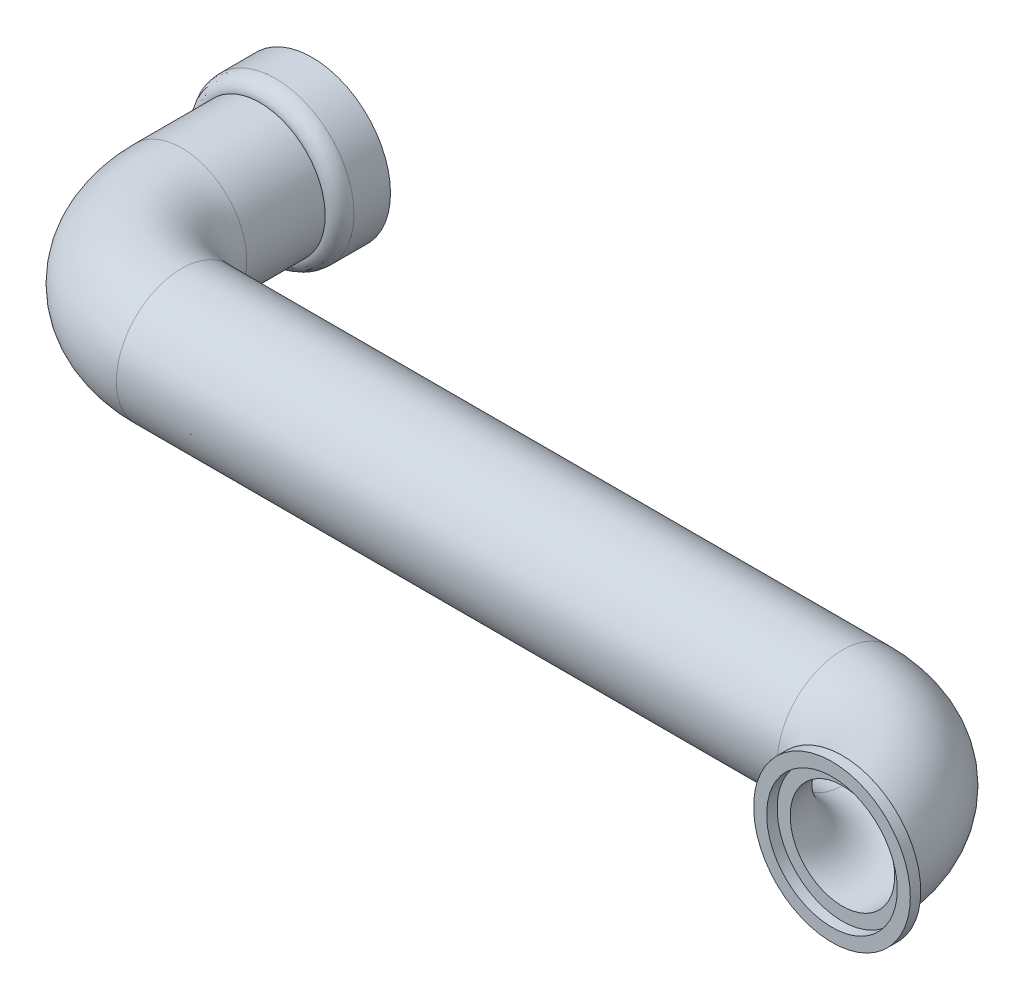
ISO-10303-21;
HEADER;
FILE_DESCRIPTION(('STEP AP214'),'2;1');
FILE_NAME('part.step','',(''),(''),'','','');
FILE_SCHEMA(('AUTOMOTIVE_DESIGN { 1 0 10303 214 1 1 1 1 }'));
ENDSEC;
DATA;
#1=APPLICATION_CONTEXT('core data for automotive mechanical design processes');
#2=APPLICATION_PROTOCOL_DEFINITION('international standard','automotive_design',2000,#1);
#3=PRODUCT_CONTEXT('',#1,'mechanical');
#4=PRODUCT('Part','Part','',(#3));
#5=PRODUCT_RELATED_PRODUCT_CATEGORY('part','',(#4));
#6=PRODUCT_DEFINITION_FORMATION('','',#4);
#7=PRODUCT_DEFINITION_CONTEXT('part definition',#1,'design');
#8=PRODUCT_DEFINITION('design','',#6,#7);
#9=PRODUCT_DEFINITION_SHAPE('','',#8);
#10=(LENGTH_UNIT() NAMED_UNIT(*) SI_UNIT(.MILLI.,.METRE.));
#11=(NAMED_UNIT(*) PLANE_ANGLE_UNIT() SI_UNIT($,.RADIAN.));
#12=(NAMED_UNIT(*) SI_UNIT($,.STERADIAN.) SOLID_ANGLE_UNIT());
#13=UNCERTAINTY_MEASURE_WITH_UNIT(LENGTH_MEASURE(1.E-05),#10,'distance_accuracy_value','');
#14=(GEOMETRIC_REPRESENTATION_CONTEXT(3) GLOBAL_UNCERTAINTY_ASSIGNED_CONTEXT((#13)) GLOBAL_UNIT_ASSIGNED_CONTEXT((#10,
#11,#12)) REPRESENTATION_CONTEXT('',''));
#15=CARTESIAN_POINT('',(0.,0.,0.));
#16=DIRECTION('',(0.,0.,1.));
#17=DIRECTION('',(1.,0.,0.));
#18=AXIS2_PLACEMENT_3D('',#15,#16,#17);
#19=CARTESIAN_POINT('',(166.5317248,0.,67.));
#20=DIRECTION('',(0.,0.,1.));
#21=DIRECTION('',(1.,0.,0.));
#22=AXIS2_PLACEMENT_3D('',#19,#20,#21);
#23=PLANE('',#22);
#24=CARTESIAN_POINT('',(166.5317248,0.,67.));
#25=DIRECTION('',(0.,0.,1.));
#26=DIRECTION('',(1.,0.,0.));
#27=AXIS2_PLACEMENT_3D('',#24,#25,#26);
#28=CIRCLE('',#27,15.);
#29=CARTESIAN_POINT('',(181.5317248,0.,67.));
#30=VERTEX_POINT('',#29);
#31=EDGE_CURVE('E11',#30,#30,#28,.T.);
#32=ORIENTED_EDGE('',*,*,#31,.T.);
#33=EDGE_LOOP('',(#32));
#34=FACE_BOUND('',#33,.T.);
#35=CARTESIAN_POINT('',(166.5317248,0.,67.));
#36=DIRECTION('',(0.,0.,1.));
#37=DIRECTION('',(1.,0.,0.));
#38=AXIS2_PLACEMENT_3D('',#35,#36,#37);
#39=CIRCLE('',#38,12.5);
#40=CARTESIAN_POINT('',(179.0317248,0.,67.));
#41=VERTEX_POINT('',#40);
#42=EDGE_CURVE('E59',#41,#41,#39,.T.);
#43=ORIENTED_EDGE('',*,*,#42,.F.);
#44=EDGE_LOOP('',(#43));
#45=FACE_BOUND('',#44,.T.);
#46=ADVANCED_FACE('F48',(#34,#45),#23,.T.);
#47=CARTESIAN_POINT('',(166.5317248,0.,65.));
#48=DIRECTION('',(0.,0.,1.));
#49=DIRECTION('',(1.,0.,0.));
#50=AXIS2_PLACEMENT_3D('',#47,#48,#49);
#51=PLANE('',#50);
#52=CARTESIAN_POINT('',(166.5317248,0.,65.));
#53=DIRECTION('',(0.,0.,1.));
#54=DIRECTION('',(1.,0.,0.));
#55=AXIS2_PLACEMENT_3D('',#52,#53,#54);
#56=CIRCLE('',#55,15.);
#57=CARTESIAN_POINT('',(181.5317248,0.,65.));
#58=VERTEX_POINT('',#57);
#59=EDGE_CURVE('E52',#58,#58,#56,.T.);
#60=ORIENTED_EDGE('',*,*,#59,.F.);
#61=EDGE_LOOP('',(#60));
#62=FACE_BOUND('',#61,.T.);
#63=CARTESIAN_POINT('',(166.5317248,0.,65.));
#64=DIRECTION('',(0.,0.,1.));
#65=DIRECTION('',(1.,0.,0.));
#66=AXIS2_PLACEMENT_3D('',#63,#64,#65);
#67=CIRCLE('',#66,12.5);
#68=CARTESIAN_POINT('',(179.0317248,0.,65.));
#69=VERTEX_POINT('',#68);
#70=EDGE_CURVE('E61',#69,#69,#67,.T.);
#71=ORIENTED_EDGE('',*,*,#70,.T.);
#72=EDGE_LOOP('',(#71));
#73=FACE_BOUND('',#72,.T.);
#74=ADVANCED_FACE('F71',(#62,#73),#51,.F.);
#75=CARTESIAN_POINT('',(166.5317248,0.,67.));
#76=DIRECTION('',(0.,0.,-1.));
#77=DIRECTION('',(-1.,0.,0.));
#78=AXIS2_PLACEMENT_3D('',#75,#76,#77);
#79=CYLINDRICAL_SURFACE('',#78,15.);
#80=ORIENTED_EDGE('',*,*,#31,.F.);
#81=EDGE_LOOP('',(#80));
#82=FACE_BOUND('',#81,.T.);
#83=ORIENTED_EDGE('',*,*,#59,.T.);
#84=EDGE_LOOP('',(#83));
#85=FACE_BOUND('',#84,.T.);
#86=ADVANCED_FACE('F50',(#82,#85),#79,.T.);
#87=CARTESIAN_POINT('',(166.5317248,0.,67.));
#88=DIRECTION('',(0.,0.,-1.));
#89=DIRECTION('',(-1.,0.,0.));
#90=AXIS2_PLACEMENT_3D('',#87,#88,#89);
#91=CYLINDRICAL_SURFACE('',#90,12.5);
#92=ORIENTED_EDGE('',*,*,#42,.T.);
#93=EDGE_LOOP('',(#92));
#94=FACE_BOUND('',#93,.T.);
#95=ORIENTED_EDGE('',*,*,#70,.F.);
#96=EDGE_LOOP('',(#95));
#97=FACE_BOUND('',#96,.T.);
#98=ADVANCED_FACE('F67',(#94,#97),#91,.F.);
#99=CLOSED_SHELL('',(#46,#74,#86,#98));
#100=MANIFOLD_SOLID_BREP('B2',#99);
#101=CARTESIAN_POINT('',(0.,0.,0.));
#102=DIRECTION('',(0.,0.,1.));
#103=DIRECTION('',(1.,0.,0.));
#104=AXIS2_PLACEMENT_3D('',#101,#102,#103);
#105=PLANE('',#104);
#106=CARTESIAN_POINT('',(0.,0.,0.));
#107=DIRECTION('',(0.,0.,1.));
#108=DIRECTION('',(1.,0.,0.));
#109=AXIS2_PLACEMENT_3D('',#106,#107,#108);
#110=CIRCLE('',#109,15.);
#111=CARTESIAN_POINT('',(15.,0.,0.));
#112=VERTEX_POINT('',#111);
#113=EDGE_CURVE('E133',#112,#112,#110,.T.);
#114=ORIENTED_EDGE('',*,*,#113,.F.);
#115=EDGE_LOOP('',(#114));
#116=FACE_BOUND('',#115,.T.);
#117=CARTESIAN_POINT('',(0.,0.,0.));
#118=DIRECTION('',(0.,0.,1.));
#119=DIRECTION('',(1.,0.,0.));
#120=AXIS2_PLACEMENT_3D('',#117,#118,#119);
#121=CIRCLE('',#120,12.5);
#122=CARTESIAN_POINT('',(12.5,0.,0.));
#123=VERTEX_POINT('',#122);
#124=EDGE_CURVE('E180',#123,#123,#121,.T.);
#125=ORIENTED_EDGE('',*,*,#124,.T.);
#126=EDGE_LOOP('',(#125));
#127=FACE_BOUND('',#126,.T.);
#128=ADVANCED_FACE('F112',(#116,#127),#105,.F.);
#129=CARTESIAN_POINT('',(0.,0.,10.));
#130=DIRECTION('',(0.,0.,-1.));
#131=DIRECTION('',(-1.,0.,0.));
#132=AXIS2_PLACEMENT_3D('',#129,#130,#131);
#133=CYLINDRICAL_SURFACE('',#132,15.);
#134=CARTESIAN_POINT('',(15.,0.,7.));
#135=CARTESIAN_POINT('',(15.,1.96349540639776,7.));
#136=CARTESIAN_POINT('',(14.6095901492237,3.92621826732311,7.));
#137=CARTESIAN_POINT('',(13.1067958261149,7.55428470362958,7.));
#138=CARTESIAN_POINT('',(11.9950026344916,9.21820080110479,7.));
#139=CARTESIAN_POINT('',(9.21820080110479,11.9950026344916,7.));
#140=CARTESIAN_POINT('',(7.55428470362781,13.1067958261157,7.));
#141=CARTESIAN_POINT('',(3.92621826732487,14.609590149223,7.));
#142=CARTESIAN_POINT('',(1.96349540639923,15.,7.));
#143=CARTESIAN_POINT('',(-1.96349540639922,15.,7.));
#144=CARTESIAN_POINT('',(-3.92621826732387,14.6095901492234,7.));
#145=CARTESIAN_POINT('',(-7.55428470362883,13.1067958261152,7.));
#146=CARTESIAN_POINT('',(-9.2182008011046,11.9950026344918,7.));
#147=CARTESIAN_POINT('',(-11.9950026344918,9.21820080110458,7.));
#148=CARTESIAN_POINT('',(-13.1067958261151,7.55428470362905,7.));
#149=CARTESIAN_POINT('',(-14.6095901492235,3.92621826732368,7.));
#150=CARTESIAN_POINT('',(-15.,1.96349540639923,7.));
#151=CARTESIAN_POINT('',(-15.,-1.96349540639922,7.));
#152=CARTESIAN_POINT('',(-14.6095901492235,-3.92621826732364,7.));
#153=CARTESIAN_POINT('',(-13.1067958261152,-7.55428470362901,7.));
#154=CARTESIAN_POINT('',(-11.9950026344911,-9.21820080110531,7.));
#155=CARTESIAN_POINT('',(-9.21820080110529,-11.9950026344911,7.));
#156=CARTESIAN_POINT('',(-7.55428470362903,-13.1067958261151,7.));
#157=CARTESIAN_POINT('',(-3.9262182673237,-14.6095901492234,7.));
#158=CARTESIAN_POINT('',(-1.9634954063992,-15.,7.));
#159=CARTESIAN_POINT('',(1.96349540639925,-15.,7.));
#160=CARTESIAN_POINT('',(3.92621826732487,-14.609590149223,7.));
#161=CARTESIAN_POINT('',(7.55428470362778,-13.1067958261157,7.));
#162=CARTESIAN_POINT('',(9.21820080110465,-11.9950026344918,7.));
#163=CARTESIAN_POINT('',(11.9950026344917,-9.21820080110472,7.));
#164=CARTESIAN_POINT('',(13.1067958261151,-7.55428470362903,7.));
#165=CARTESIAN_POINT('',(14.6095901492234,-3.9262182673237,7.));
#166=CARTESIAN_POINT('',(15.,-1.96349540639777,7.));
#167=CARTESIAN_POINT('',(15.,0.,7.));
#168=(BOUNDED_CURVE() B_SPLINE_CURVE(3,(#134,#135,#136,#137,#138,#139,#140,#141,#142,#143,#144,
#145,#146,#147,#148,#149,#150,#151,#152,#153,#154,#155,#156,#157,#158,#159,#160,#161,#162,#163,
#164,#165,#166,#167),.UNSPECIFIED.,.T.,.F.) B_SPLINE_CURVE_WITH_KNOTS((4,2,2,2,2,2,2,2,2,2,2,2,
2,2,2,2,4),(0.,0.392699081698724,0.785398163397448,1.17809724509617,1.5707963267949,
1.96349540849362,2.35619449019234,2.74889357189107,3.14159265358979,3.53429173528852,
3.92699081698724,4.31968989868597,4.71238898038469,5.10508806208341,5.49778714378214,
5.89048622548086,6.28318530717959),
.UNSPECIFIED.) CURVE() GEOMETRIC_REPRESENTATION_ITEM() RATIONAL_B_SPLINE_CURVE((1.,1.,1.,1.,1.,
1.,1.,1.,1.,1.,1.,1.,1.,1.,1.,1.,1.,1.,1.,1.,1.,1.,1.,1.,1.,1.,1.,1.,1.,1.,1.,1.,1.,1.)) REPRESENTATION_ITEM(''));
#169=CARTESIAN_POINT('',(15.,0.,7.));
#170=VERTEX_POINT('',#169);
#171=EDGE_CURVE('E127',#170,#170,#168,.F.);
#172=ORIENTED_EDGE('',*,*,#171,.T.);
#173=EDGE_LOOP('',(#172));
#174=FACE_BOUND('',#173,.T.);
#175=ORIENTED_EDGE('',*,*,#113,.T.);
#176=EDGE_LOOP('',(#175));
#177=FACE_BOUND('',#176,.T.);
#178=ADVANCED_FACE('F193',(#174,#177),#133,.T.);
#179=CARTESIAN_POINT('',(0.,0.,10.));
#180=DIRECTION('',(0.,0.,-1.));
#181=DIRECTION('',(-1.,0.,0.));
#182=AXIS2_PLACEMENT_3D('',#179,#180,#181);
#183=CYLINDRICAL_SURFACE('',#182,12.5);
#184=CARTESIAN_POINT('',(0.,0.,9.));
#185=DIRECTION('',(0.,0.,-1.));
#186=DIRECTION('',(-1.,0.,0.));
#187=AXIS2_PLACEMENT_3D('',#184,#185,#186);
#188=CIRCLE('',#187,12.5);
#189=CARTESIAN_POINT('',(-12.5,0.,9.));
#190=VERTEX_POINT('',#189);
#191=EDGE_CURVE('E47',#190,#190,#188,.T.);
#192=ORIENTED_EDGE('',*,*,#191,.F.);
#193=EDGE_LOOP('',(#192));
#194=FACE_BOUND('',#193,.T.);
#195=ORIENTED_EDGE('',*,*,#124,.F.);
#196=EDGE_LOOP('',(#195));
#197=FACE_BOUND('',#196,.T.);
#198=ADVANCED_FACE('F202',(#194,#197),#183,.F.);
#199=CARTESIAN_POINT('',(12.5,0.,10.));
#200=CARTESIAN_POINT('',(12.5,1.63624617199814,10.));
#201=CARTESIAN_POINT('',(12.1746584576861,3.27184855610282,10.));
#202=CARTESIAN_POINT('',(10.9223298550961,6.29523725302442,10.));
#203=CARTESIAN_POINT('',(9.99583552874398,7.68183400092113,10.));
#204=CARTESIAN_POINT('',(7.68183400091971,9.99583552874256,10.));
#205=CARTESIAN_POINT('',(6.29523725302337,10.9223298550966,10.));
#206=CARTESIAN_POINT('',(3.27184855610386,12.1746584576856,10.));
#207=CARTESIAN_POINT('',(1.63624617199936,12.5,10.));
#208=CARTESIAN_POINT('',(-1.63624617199935,12.5,10.));
#209=CARTESIAN_POINT('',(-3.27184855610387,12.174658457687,10.));
#210=CARTESIAN_POINT('',(-6.29523725302338,10.9223298550951,10.));
#211=CARTESIAN_POINT('',(-7.68183400091991,9.99583552874237,10.));
#212=CARTESIAN_POINT('',(-9.9958355287438,7.68183400092131,10.));
#213=CARTESIAN_POINT('',(-10.9223298550965,6.2952372530241,10.));
#214=CARTESIAN_POINT('',(-12.1746584576856,3.27184855610318,10.));
#215=CARTESIAN_POINT('',(-12.5,1.63624617199936,10.));
#216=CARTESIAN_POINT('',(-12.5,-1.63624617199935,10.));
#217=CARTESIAN_POINT('',(-12.1746584576856,-3.27184855610314,10.));
#218=CARTESIAN_POINT('',(-10.9223298550966,-6.29523725302407,10.));
#219=CARTESIAN_POINT('',(-9.99583552874378,-7.68183400092132,10.));
#220=CARTESIAN_POINT('',(-7.68183400091989,-9.99583552874238,10.));
#221=CARTESIAN_POINT('',(-6.29523725302398,-10.9223298550959,10.));
#222=CARTESIAN_POINT('',(-3.2718485561033,-12.1746584576862,10.));
#223=CARTESIAN_POINT('',(-1.63624617199934,-12.5,10.));
#224=CARTESIAN_POINT('',(1.63624617199938,-12.5,10.));
#225=CARTESIAN_POINT('',(3.27184855610397,-12.1746584576877,10.));
#226=CARTESIAN_POINT('',(6.29523725302323,-10.9223298550945,10.));
#227=CARTESIAN_POINT('',(7.68183400092197,-9.99583552874456,10.));
#228=CARTESIAN_POINT('',(9.99583552874167,-7.68183400091918,10.));
#229=CARTESIAN_POINT('',(10.9223298550959,-6.29523725302398,10.));
#230=CARTESIAN_POINT('',(12.1746584576862,-3.2718485561033,10.));
#231=CARTESIAN_POINT('',(12.5,-1.63624617199814,10.));
#232=CARTESIAN_POINT('',(12.5,0.,10.));
#233=CARTESIAN_POINT('',(15.,0.,10.));
#234=CARTESIAN_POINT('',(15.0000000000014,1.96349540639776,10.));
#235=CARTESIAN_POINT('',(14.6095901492247,3.92621826732353,10.));
#236=CARTESIAN_POINT('',(13.1067958261139,7.55428470362917,10.));
#237=CARTESIAN_POINT('',(11.9950026344931,9.21820080110621,10.));
#238=CARTESIAN_POINT('',(9.21820080110337,11.9950026344902,10.));
#239=CARTESIAN_POINT('',(7.5542847036279,13.1067958261159,10.));
#240=CARTESIAN_POINT('',(3.92621826732478,14.6095901492227,10.));
#241=CARTESIAN_POINT('',(1.96349540639923,15.,10.));
#242=CARTESIAN_POINT('',(-1.96349540639922,15.,10.));
#243=CARTESIAN_POINT('',(-3.92621826732408,14.6095901492256,9.99999999999858));
#244=CARTESIAN_POINT('',(-7.55428470362862,13.106795826113,10.0000000000014));
#245=CARTESIAN_POINT('',(-9.21820080110389,11.9950026344911,10.));
#246=CARTESIAN_POINT('',(-11.9950026344926,9.21820080110529,10.));
#247=CARTESIAN_POINT('',(-13.1067958261159,7.55428470362935,10.));
#248=CARTESIAN_POINT('',(-14.6095901492227,3.92621826732339,10.));
#249=CARTESIAN_POINT('',(-15.,1.96349540639923,10.));
#250=CARTESIAN_POINT('',(-15.,-1.96349540639922,10.));
#251=CARTESIAN_POINT('',(-14.6095901492228,-3.92621826732335,10.));
#252=CARTESIAN_POINT('',(-13.1067958261159,-7.55428470362931,10.));
#253=CARTESIAN_POINT('',(-11.9950026344925,-9.21820080110672,10.));
#254=CARTESIAN_POINT('',(-9.21820080110387,-11.9950026344897,10.));
#255=CARTESIAN_POINT('',(-7.55428470362948,-13.1067958261145,10.0000000000014));
#256=CARTESIAN_POINT('',(-3.92621826732325,-14.6095901492241,9.99999999999858));
#257=CARTESIAN_POINT('',(-1.9634954063992,-15.,10.));
#258=CARTESIAN_POINT('',(1.96349540639925,-15.,10.));
#259=CARTESIAN_POINT('',(3.92621826732534,-14.6095901492241,10.));
#260=CARTESIAN_POINT('',(7.55428470362731,-13.1067958261145,10.));
#261=CARTESIAN_POINT('',(9.21820080110608,-11.9950026344932,10.));
#262=CARTESIAN_POINT('',(11.9950026344903,-9.2182008011033,10.));
#263=CARTESIAN_POINT('',(13.1067958261145,-7.55428470362948,10.0000000000014));
#264=CARTESIAN_POINT('',(14.6095901492241,-3.92621826732325,9.99999999999858));
#265=CARTESIAN_POINT('',(14.9999999999986,-1.96349540639777,10.));
#266=CARTESIAN_POINT('',(15.,0.,10.));
#267=CARTESIAN_POINT('',(15.,0.,7.));
#268=CARTESIAN_POINT('',(15.,1.96349540639776,7.));
#269=CARTESIAN_POINT('',(14.6095901492237,3.92621826732311,7.));
#270=CARTESIAN_POINT('',(13.1067958261149,7.55428470362958,7.));
#271=CARTESIAN_POINT('',(11.9950026344916,9.21820080110479,7.));
#272=CARTESIAN_POINT('',(9.21820080110479,11.9950026344916,7.));
#273=CARTESIAN_POINT('',(7.55428470362781,13.1067958261157,7.));
#274=CARTESIAN_POINT('',(3.92621826732487,14.609590149223,7.));
#275=CARTESIAN_POINT('',(1.96349540639923,15.,7.));
#276=CARTESIAN_POINT('',(-1.96349540639922,15.,7.));
#277=CARTESIAN_POINT('',(-3.92621826732388,14.6095901492234,7.));
#278=CARTESIAN_POINT('',(-7.55428470362883,13.1067958261152,7.));
#279=CARTESIAN_POINT('',(-9.2182008011046,11.9950026344918,7.));
#280=CARTESIAN_POINT('',(-11.9950026344918,9.21820080110458,7.));
#281=CARTESIAN_POINT('',(-13.1067958261151,7.55428470362905,7.));
#282=CARTESIAN_POINT('',(-14.6095901492235,3.92621826732368,7.));
#283=CARTESIAN_POINT('',(-15.,1.96349540639923,7.));
#284=CARTESIAN_POINT('',(-15.,-1.96349540639922,7.));
#285=CARTESIAN_POINT('',(-14.6095901492235,-3.92621826732364,7.));
#286=CARTESIAN_POINT('',(-13.1067958261152,-7.55428470362901,7.));
#287=CARTESIAN_POINT('',(-11.9950026344911,-9.21820080110531,7.));
#288=CARTESIAN_POINT('',(-9.21820080110529,-11.9950026344911,7.));
#289=CARTESIAN_POINT('',(-7.55428470362903,-13.1067958261151,7.));
#290=CARTESIAN_POINT('',(-3.9262182673237,-14.6095901492234,7.));
#291=CARTESIAN_POINT('',(-1.9634954063992,-15.,7.));
#292=CARTESIAN_POINT('',(1.96349540639925,-15.,7.));
#293=CARTESIAN_POINT('',(3.92621826732487,-14.609590149223,7.));
#294=CARTESIAN_POINT('',(7.55428470362778,-13.1067958261157,7.));
#295=CARTESIAN_POINT('',(9.21820080110465,-11.9950026344918,7.));
#296=CARTESIAN_POINT('',(11.9950026344917,-9.21820080110472,7.));
#297=CARTESIAN_POINT('',(13.1067958261151,-7.55428470362903,7.));
#298=CARTESIAN_POINT('',(14.6095901492234,-3.9262182673237,7.));
#299=CARTESIAN_POINT('',(15.,-1.96349540639777,7.));
#300=CARTESIAN_POINT('',(15.,0.,7.));
#301=(BOUNDED_SURFACE() B_SPLINE_SURFACE(2,3,((#199,#200,#201,#202,#203,#204,#205,#206,#207,
#208,#209,#210,#211,#212,#213,#214,#215,#216,#217,#218,#219,#220,#221,#222,#223,#224,#225,#226,
#227,#228,#229,#230,#231,#232),(#233,#234,#235,#236,#237,#238,#239,#240,#241,#242,#243,#244,
#245,#246,#247,#248,#249,#250,#251,#252,#253,#254,#255,#256,#257,#258,#259,#260,#261,#262,#263,
#264,#265,#266),(#267,#268,#269,#270,#271,#272,#273,#274,#275,#276,#277,#278,#279,#280,#281,
#282,#283,#284,#285,#286,#287,#288,#289,#290,#291,#292,#293,#294,#295,#296,#297,#298,#299,
#300)),.UNSPECIFIED.,.F.,.T.,.F.) B_SPLINE_SURFACE_WITH_KNOTS((3,3),(4,2,2,2,2,2,2,2,2,2,2,2,2,
2,2,2,4),(0.,1.),(0.,0.392699081698724,0.785398163397448,1.17809724509617,1.5707963267949,
1.96349540849362,2.35619449019234,2.74889357189107,3.14159265358979,3.53429173528852,
3.92699081698724,4.31968989868597,4.71238898038469,5.10508806208341,5.49778714378214,
5.89048622548086,6.28318530717959),
.UNSPECIFIED.) GEOMETRIC_REPRESENTATION_ITEM() RATIONAL_B_SPLINE_SURFACE(((1.,1.,1.,1.,1.,1.,1.,
1.,1.,1.,1.,1.,1.,1.,1.,1.,1.,1.,1.,1.,1.,1.,1.,1.,1.,1.,1.,1.,1.,1.,1.,1.,1.,1.),
(0.707106781186547,0.707106781186547,0.707106781186548,0.707106781186548,0.707106781186548,
0.707106781186548,0.707106781186548,0.707106781186548,0.707106781186547,0.707106781186547,
0.707106781186548,0.707106781186548,0.707106781186548,0.707106781186548,0.707106781186548,
0.707106781186548,0.707106781186547,0.707106781186547,0.707106781186548,0.707106781186548,
0.707106781186548,0.707106781186548,0.707106781186548,0.707106781186548,0.707106781186547,
0.707106781186547,0.707106781186548,0.707106781186548,0.707106781186548,0.707106781186548,
0.707106781186548,0.707106781186548,0.707106781186547,0.707106781186547),(1.,1.,1.,1.,1.,1.,1.,
1.,1.,1.,1.,1.,1.,1.,1.,1.,1.,1.,1.,1.,1.,1.,1.,1.,1.,1.,1.,1.,1.,1.,1.,1.,1.,1.))) REPRESENTATION_ITEM('') SURFACE());
#302=CARTESIAN_POINT('',(12.5,0.,10.));
#303=CARTESIAN_POINT('',(12.5,-1.63624617199814,10.));
#304=CARTESIAN_POINT('',(12.1746584576862,-3.2718485561033,10.));
#305=CARTESIAN_POINT('',(10.9223298550959,-6.29523725302398,10.));
#306=CARTESIAN_POINT('',(9.99583552874167,-7.68183400091918,10.));
#307=CARTESIAN_POINT('',(7.68183400092197,-9.99583552874456,10.));
#308=CARTESIAN_POINT('',(6.29523725302323,-10.9223298550945,10.));
#309=CARTESIAN_POINT('',(3.27184855610397,-12.1746584576877,10.));
#310=CARTESIAN_POINT('',(1.63624617199938,-12.5,10.));
#311=CARTESIAN_POINT('',(-1.63624617199934,-12.5,10.));
#312=CARTESIAN_POINT('',(-3.2718485561033,-12.1746584576862,10.));
#313=CARTESIAN_POINT('',(-6.29523725302398,-10.9223298550959,10.));
#314=CARTESIAN_POINT('',(-7.68183400091989,-9.99583552874238,10.));
#315=CARTESIAN_POINT('',(-9.99583552874378,-7.68183400092132,10.));
#316=CARTESIAN_POINT('',(-10.9223298550966,-6.29523725302407,10.));
#317=CARTESIAN_POINT('',(-12.1746584576856,-3.27184855610314,10.));
#318=CARTESIAN_POINT('',(-12.5,-1.63624617199935,10.));
#319=CARTESIAN_POINT('',(-12.5,1.63624617199936,10.));
#320=CARTESIAN_POINT('',(-12.1746584576856,3.27184855610318,10.));
#321=CARTESIAN_POINT('',(-10.9223298550965,6.2952372530241,10.));
#322=CARTESIAN_POINT('',(-9.9958355287438,7.68183400092131,10.));
#323=CARTESIAN_POINT('',(-7.68183400091991,9.99583552874237,10.));
#324=CARTESIAN_POINT('',(-6.29523725302338,10.9223298550951,10.));
#325=CARTESIAN_POINT('',(-3.27184855610387,12.174658457687,10.));
#326=CARTESIAN_POINT('',(-1.63624617199935,12.5,10.));
#327=CARTESIAN_POINT('',(1.63624617199936,12.5,10.));
#328=CARTESIAN_POINT('',(3.27184855610386,12.1746584576856,10.));
#329=CARTESIAN_POINT('',(6.29523725302337,10.9223298550966,10.));
#330=CARTESIAN_POINT('',(7.68183400091971,9.99583552874256,10.));
#331=CARTESIAN_POINT('',(9.99583552874398,7.68183400092113,10.));
#332=CARTESIAN_POINT('',(10.9223298550961,6.29523725302442,10.));
#333=CARTESIAN_POINT('',(12.1746584576861,3.27184855610282,10.));
#334=CARTESIAN_POINT('',(12.5,1.63624617199814,10.));
#335=CARTESIAN_POINT('',(12.5,0.,10.));
#336=(BOUNDED_CURVE() B_SPLINE_CURVE(3,(#302,#303,#304,#305,#306,#307,#308,#309,#310,#311,#312,
#313,#314,#315,#316,#317,#318,#319,#320,#321,#322,#323,#324,#325,#326,#327,#328,#329,#330,#331,
#332,#333,#334,#335),.UNSPECIFIED.,.T.,.F.) B_SPLINE_CURVE_WITH_KNOTS((4,2,2,2,2,2,2,2,2,2,2,2,
2,2,2,2,4),(0.,0.392699081698725,0.785398163397448,1.17809724509617,1.5707963267949,
1.96349540849362,2.35619449019234,2.74889357189107,3.14159265358979,3.53429173528852,
3.92699081698724,4.31968989868597,4.71238898038469,5.10508806208341,5.49778714378214,
5.89048622548086,6.28318530717959),
.UNSPECIFIED.) CURVE() GEOMETRIC_REPRESENTATION_ITEM() RATIONAL_B_SPLINE_CURVE((1.,1.,1.,1.,1.,
1.,1.,1.,1.,1.,1.,1.,1.,1.,1.,1.,1.,1.,1.,1.,1.,1.,1.,1.,1.,1.,1.,1.,1.,1.,1.,1.,1.,1.)) REPRESENTATION_ITEM(''));
#337=CARTESIAN_POINT('',(12.5,0.,10.));
#338=VERTEX_POINT('',#337);
#339=EDGE_CURVE('E141',#338,#338,#336,.F.);
#340=ORIENTED_EDGE('',*,*,#171,.F.);
#341=EDGE_LOOP('',(#340));
#342=FACE_BOUND('',#341,.T.);
#343=ORIENTED_EDGE('',*,*,#339,.F.);
#344=EDGE_LOOP('',(#343));
#345=FACE_BOUND('',#344,.T.);
#346=ADVANCED_FACE('F115',(#342,#345),#301,.T.);
#347=CARTESIAN_POINT('',(0.,0.,9.));
#348=DIRECTION('',(0.,0.,-1.));
#349=DIRECTION('',(-1.,0.,0.));
#350=AXIS2_PLACEMENT_3D('',#347,#348,#349);
#351=PLANE('',#350);
#352=ORIENTED_EDGE('',*,*,#191,.T.);
#353=EDGE_LOOP('',(#352));
#354=FACE_BOUND('',#353,.T.);
#355=CARTESIAN_POINT('',(0.,0.,9.));
#356=DIRECTION('',(0.,0.,-1.));
#357=DIRECTION('',(-1.,0.,0.));
#358=AXIS2_PLACEMENT_3D('',#355,#356,#357);
#359=CIRCLE('',#358,10.);
#360=CARTESIAN_POINT('',(-10.,0.,9.));
#361=VERTEX_POINT('',#360);
#362=EDGE_CURVE('E151',#361,#361,#359,.T.);
#363=ORIENTED_EDGE('',*,*,#362,.F.);
#364=EDGE_LOOP('',(#363));
#365=FACE_BOUND('',#364,.T.);
#366=ADVANCED_FACE('F209',(#354,#365),#351,.T.);
#367=CARTESIAN_POINT('',(0.,0.,9.));
#368=DIRECTION('',(0.,0.,1.));
#369=DIRECTION('',(1.,0.,0.));
#370=AXIS2_PLACEMENT_3D('',#367,#368,#369);
#371=CYLINDRICAL_SURFACE('',#370,10.);
#372=ORIENTED_EDGE('',*,*,#362,.T.);
#373=EDGE_LOOP('',(#372));
#374=FACE_BOUND('',#373,.T.);
#375=CARTESIAN_POINT('',(0.,0.,25.));
#376=DIRECTION('',(0.,0.,1.));
#377=DIRECTION('',(1.,0.,0.));
#378=AXIS2_PLACEMENT_3D('',#375,#376,#377);
#379=CIRCLE('',#378,10.);
#380=CARTESIAN_POINT('',(-9.99999999999999,0.,25.));
#381=VERTEX_POINT('',#380);
#382=EDGE_CURVE('E168',#381,#381,#379,.F.);
#383=ORIENTED_EDGE('',*,*,#382,.F.);
#384=EDGE_LOOP('',(#383));
#385=FACE_BOUND('',#384,.T.);
#386=ADVANCED_FACE('F212',(#374,#385),#371,.F.);
#387=CARTESIAN_POINT('',(0.,0.,25.));
#388=DIRECTION('',(0.,0.,-1.));
#389=DIRECTION('',(-1.,0.,0.));
#390=AXIS2_PLACEMENT_3D('',#387,#388,#389);
#391=CYLINDRICAL_SURFACE('',#390,12.5);
#392=CARTESIAN_POINT('',(0.,0.,25.));
#393=DIRECTION('',(0.,0.,1.));
#394=DIRECTION('',(1.,0.,0.));
#395=AXIS2_PLACEMENT_3D('',#392,#393,#394);
#396=CIRCLE('',#395,12.5);
#397=CARTESIAN_POINT('',(-12.5,0.,25.));
#398=VERTEX_POINT('',#397);
#399=EDGE_CURVE('E146',#398,#398,#396,.T.);
#400=ORIENTED_EDGE('',*,*,#399,.F.);
#401=EDGE_LOOP('',(#400));
#402=FACE_BOUND('',#401,.T.);
#403=ORIENTED_EDGE('',*,*,#339,.T.);
#404=EDGE_LOOP('',(#403));
#405=FACE_BOUND('',#404,.T.);
#406=ADVANCED_FACE('F142',(#402,#405),#391,.T.);
#407=CARTESIAN_POINT('',(20.,0.,25.));
#408=DIRECTION('',(0.,1.,0.));
#409=DIRECTION('',(0.,0.,1.));
#410=AXIS2_PLACEMENT_3D('',#407,#408,#409);
#411=TOROIDAL_SURFACE('',#410,20.,12.5);
#412=CARTESIAN_POINT('',(20.,0.,45.));
#413=DIRECTION('',(1.,0.,0.));
#414=DIRECTION('',(0.,0.,-1.));
#415=AXIS2_PLACEMENT_3D('',#412,#413,#414);
#416=CIRCLE('',#415,12.5);
#417=CARTESIAN_POINT('',(20.,0.,57.5));
#418=VERTEX_POINT('',#417);
#419=EDGE_CURVE('E170',#418,#418,#416,.T.);
#420=CARTESIAN_POINT('',(20.,0.,25.));
#421=DIRECTION('',(0.,1.,0.));
#422=DIRECTION('',(0.,0.,1.));
#423=AXIS2_PLACEMENT_3D('',#420,#421,#422);
#424=CIRCLE('',#423,32.5);
#425=EDGE_CURVE('',#398,#418,#424,.T.);
#426=ORIENTED_EDGE('',*,*,#399,.T.);
#427=ORIENTED_EDGE('',*,*,#419,.F.);
#428=ORIENTED_EDGE('',*,*,#425,.T.);
#429=ORIENTED_EDGE('',*,*,#425,.F.);
#430=EDGE_LOOP('',(#426,#428,#427,#429));
#431=FACE_BOUND('',#430,.T.);
#432=ADVANCED_FACE('F218',(#431),#411,.T.);
#433=CARTESIAN_POINT('',(20.,0.,45.));
#434=DIRECTION('',(1.,0.,0.));
#435=DIRECTION('',(0.,0.,-1.));
#436=AXIS2_PLACEMENT_3D('',#433,#434,#435);
#437=CYLINDRICAL_SURFACE('',#436,12.5);
#438=CARTESIAN_POINT('',(146.5317248,0.,45.));
#439=DIRECTION('',(1.,0.,0.));
#440=DIRECTION('',(0.,0.,-1.));
#441=AXIS2_PLACEMENT_3D('',#438,#439,#440);
#442=CIRCLE('',#441,12.5);
#443=CARTESIAN_POINT('',(146.5317248,0.,32.5));
#444=VERTEX_POINT('',#443);
#445=EDGE_CURVE('E169',#444,#444,#442,.T.);
#446=ORIENTED_EDGE('',*,*,#445,.F.);
#447=EDGE_LOOP('',(#446));
#448=FACE_BOUND('',#447,.T.);
#449=ORIENTED_EDGE('',*,*,#419,.T.);
#450=EDGE_LOOP('',(#449));
#451=FACE_BOUND('',#450,.T.);
#452=ADVANCED_FACE('F225',(#448,#451),#437,.T.);
#453=CARTESIAN_POINT('',(146.5317248,0.,65.0000000000003));
#454=DIRECTION('',(0.,-1.,0.));
#455=DIRECTION('',(0.,0.,-1.));
#456=AXIS2_PLACEMENT_3D('',#453,#454,#455);
#457=TOROIDAL_SURFACE('',#456,20.0000000000003,12.5);
#458=CARTESIAN_POINT('',(166.5317248,0.,65.));
#459=DIRECTION('',(0.,0.,1.));
#460=DIRECTION('',(1.,0.,0.));
#461=AXIS2_PLACEMENT_3D('',#458,#459,#460);
#462=CIRCLE('',#461,12.5);
#463=CARTESIAN_POINT('',(179.0317248,0.,64.9999999999998));
#464=VERTEX_POINT('',#463);
#465=EDGE_CURVE('E164',#464,#464,#462,.T.);
#466=CARTESIAN_POINT('',(146.5317248,0.,65.0000000000003));
#467=DIRECTION('',(0.,-1.,0.));
#468=DIRECTION('',(0.,0.,-1.));
#469=AXIS2_PLACEMENT_3D('',#466,#467,#468);
#470=CIRCLE('',#469,32.5000000000003);
#471=EDGE_CURVE('',#444,#464,#470,.T.);
#472=ORIENTED_EDGE('',*,*,#445,.T.);
#473=ORIENTED_EDGE('',*,*,#465,.F.);
#474=ORIENTED_EDGE('',*,*,#471,.T.);
#475=ORIENTED_EDGE('',*,*,#471,.F.);
#476=EDGE_LOOP('',(#472,#474,#473,#475));
#477=FACE_BOUND('',#476,.T.);
#478=ADVANCED_FACE('F221',(#477),#457,.T.);
#479=CARTESIAN_POINT('',(166.5317248,0.,65.));
#480=DIRECTION('',(0.,0.,1.));
#481=DIRECTION('',(1.,0.,0.));
#482=AXIS2_PLACEMENT_3D('',#479,#480,#481);
#483=PLANE('',#482);
#484=CARTESIAN_POINT('',(166.5317248,0.,65.));
#485=DIRECTION('',(0.,0.,1.));
#486=DIRECTION('',(1.,0.,0.));
#487=AXIS2_PLACEMENT_3D('',#484,#485,#486);
#488=CIRCLE('',#487,10.);
#489=CARTESIAN_POINT('',(176.5317248,0.,64.9999999999998));
#490=VERTEX_POINT('',#489);
#491=EDGE_CURVE('E147',#490,#490,#488,.F.);
#492=ORIENTED_EDGE('',*,*,#491,.T.);
#493=EDGE_LOOP('',(#492));
#494=FACE_BOUND('',#493,.T.);
#495=ORIENTED_EDGE('',*,*,#465,.T.);
#496=EDGE_LOOP('',(#495));
#497=FACE_BOUND('',#496,.T.);
#498=ADVANCED_FACE('F224',(#494,#497),#483,.T.);
#499=CARTESIAN_POINT('',(20.,0.,25.));
#500=DIRECTION('',(0.,1.,0.));
#501=DIRECTION('',(0.,0.,1.));
#502=AXIS2_PLACEMENT_3D('',#499,#500,#501);
#503=TOROIDAL_SURFACE('',#502,20.,10.);
#504=CARTESIAN_POINT('',(20.,0.,45.));
#505=DIRECTION('',(1.,0.,0.));
#506=DIRECTION('',(0.,0.,-1.));
#507=AXIS2_PLACEMENT_3D('',#504,#505,#506);
#508=CIRCLE('',#507,10.);
#509=CARTESIAN_POINT('',(20.,0.,55.));
#510=VERTEX_POINT('',#509);
#511=EDGE_CURVE('E160',#510,#510,#508,.F.);
#512=CARTESIAN_POINT('',(20.,0.,25.));
#513=DIRECTION('',(0.,1.,0.));
#514=DIRECTION('',(0.,0.,1.));
#515=AXIS2_PLACEMENT_3D('',#512,#513,#514);
#516=CIRCLE('',#515,30.);
#517=EDGE_CURVE('',#381,#510,#516,.T.);
#518=ORIENTED_EDGE('',*,*,#382,.T.);
#519=ORIENTED_EDGE('',*,*,#511,.F.);
#520=ORIENTED_EDGE('',*,*,#517,.T.);
#521=ORIENTED_EDGE('',*,*,#517,.F.);
#522=EDGE_LOOP('',(#518,#520,#519,#521));
#523=FACE_BOUND('',#522,.T.);
#524=ADVANCED_FACE('F235',(#523),#503,.F.);
#525=CARTESIAN_POINT('',(20.,0.,45.));
#526=DIRECTION('',(1.,0.,0.));
#527=DIRECTION('',(0.,0.,-1.));
#528=AXIS2_PLACEMENT_3D('',#525,#526,#527);
#529=CYLINDRICAL_SURFACE('',#528,10.);
#530=CARTESIAN_POINT('',(146.5317248,0.,45.));
#531=DIRECTION('',(1.,0.,0.));
#532=DIRECTION('',(0.,0.,-1.));
#533=AXIS2_PLACEMENT_3D('',#530,#531,#532);
#534=CIRCLE('',#533,10.);
#535=CARTESIAN_POINT('',(146.5317248,0.,35.));
#536=VERTEX_POINT('',#535);
#537=EDGE_CURVE('E154',#536,#536,#534,.F.);
#538=ORIENTED_EDGE('',*,*,#537,.F.);
#539=EDGE_LOOP('',(#538));
#540=FACE_BOUND('',#539,.T.);
#541=ORIENTED_EDGE('',*,*,#511,.T.);
#542=EDGE_LOOP('',(#541));
#543=FACE_BOUND('',#542,.T.);
#544=ADVANCED_FACE('F238',(#540,#543),#529,.F.);
#545=CARTESIAN_POINT('',(146.5317248,0.,65.0000000000003));
#546=DIRECTION('',(0.,-1.,0.));
#547=DIRECTION('',(0.,0.,-1.));
#548=AXIS2_PLACEMENT_3D('',#545,#546,#547);
#549=TOROIDAL_SURFACE('',#548,20.0000000000003,10.);
#550=CARTESIAN_POINT('',(146.5317248,0.,65.0000000000003));
#551=DIRECTION('',(0.,-1.,0.));
#552=DIRECTION('',(0.,0.,-1.));
#553=AXIS2_PLACEMENT_3D('',#550,#551,#552);
#554=CIRCLE('',#553,30.0000000000003);
#555=EDGE_CURVE('',#536,#490,#554,.T.);
#556=ORIENTED_EDGE('',*,*,#537,.T.);
#557=ORIENTED_EDGE('',*,*,#491,.F.);
#558=ORIENTED_EDGE('',*,*,#555,.T.);
#559=ORIENTED_EDGE('',*,*,#555,.F.);
#560=EDGE_LOOP('',(#556,#558,#557,#559));
#561=FACE_BOUND('',#560,.T.);
#562=ADVANCED_FACE('F220',(#561),#549,.F.);
#563=CLOSED_SHELL('',(#128,#178,#198,#346,#366,#386,#406,#432,#452,#478,#498,#524,#544,#562));
#564=MANIFOLD_SOLID_BREP('B6',#563);
#565=ADVANCED_BREP_SHAPE_REPRESENTATION('',(#18,#100,#564),#14);
#566=SHAPE_DEFINITION_REPRESENTATION(#9,#565);
ENDSEC;
END-ISO-10303-21;
